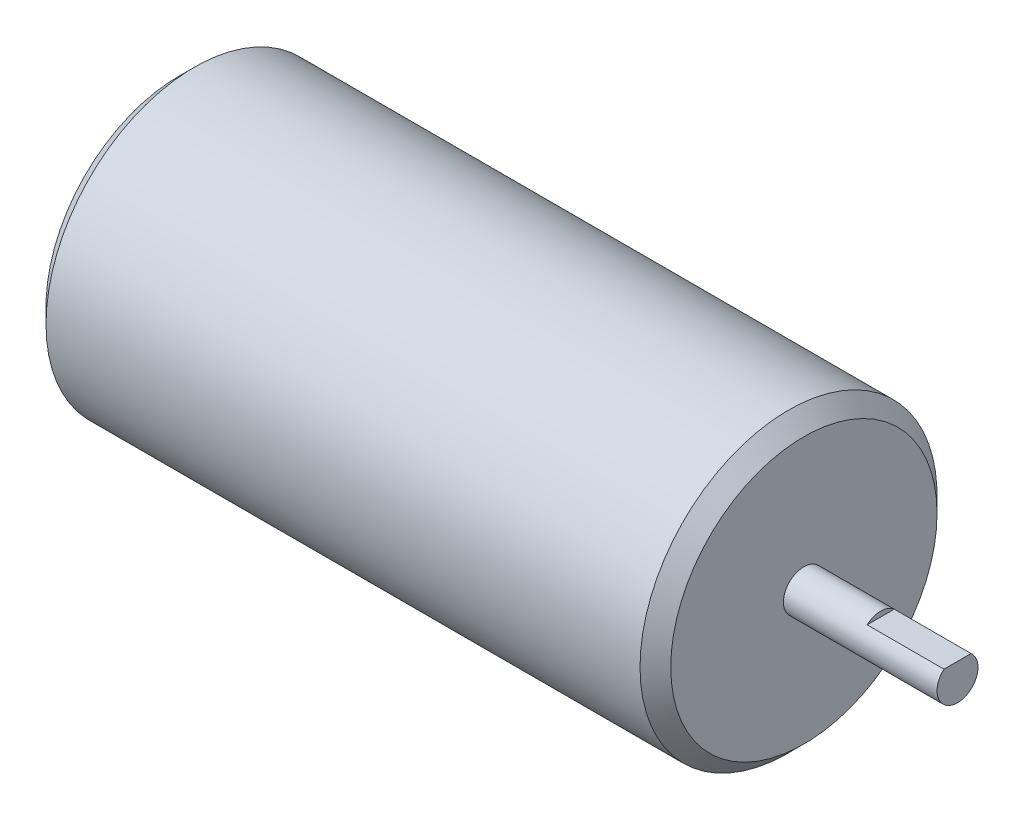
ISO-10303-21;
HEADER;
FILE_DESCRIPTION(('STEP AP214'),'2;1');
FILE_NAME('part.step','',(''),(''),'','','');
FILE_SCHEMA(('AUTOMOTIVE_DESIGN { 1 0 10303 214 1 1 1 1 }'));
ENDSEC;
DATA;
#1=APPLICATION_CONTEXT('core data for automotive mechanical design processes');
#2=APPLICATION_PROTOCOL_DEFINITION('international standard','automotive_design',2000,#1);
#3=PRODUCT_CONTEXT('',#1,'mechanical');
#4=PRODUCT('Part','Part','',(#3));
#5=PRODUCT_RELATED_PRODUCT_CATEGORY('part','',(#4));
#6=PRODUCT_DEFINITION_FORMATION('','',#4);
#7=PRODUCT_DEFINITION_CONTEXT('part definition',#1,'design');
#8=PRODUCT_DEFINITION('design','',#6,#7);
#9=PRODUCT_DEFINITION_SHAPE('','',#8);
#10=(LENGTH_UNIT() NAMED_UNIT(*) SI_UNIT(.MILLI.,.METRE.));
#11=(NAMED_UNIT(*) PLANE_ANGLE_UNIT() SI_UNIT($,.RADIAN.));
#12=(NAMED_UNIT(*) SI_UNIT($,.STERADIAN.) SOLID_ANGLE_UNIT());
#13=UNCERTAINTY_MEASURE_WITH_UNIT(LENGTH_MEASURE(1.E-05),#10,'distance_accuracy_value','');
#14=(GEOMETRIC_REPRESENTATION_CONTEXT(3) GLOBAL_UNCERTAINTY_ASSIGNED_CONTEXT((#13)) GLOBAL_UNIT_ASSIGNED_CONTEXT((#10,
#11,#12)) REPRESENTATION_CONTEXT('',''));
#15=CARTESIAN_POINT('',(0.,0.,0.));
#16=DIRECTION('',(0.,0.,1.));
#17=DIRECTION('',(1.,0.,0.));
#18=AXIS2_PLACEMENT_3D('',#15,#16,#17);
#19=CARTESIAN_POINT('',(122.,0.,0.));
#20=DIRECTION('',(-1.,0.,0.));
#21=DIRECTION('',(0.,0.,1.));
#22=AXIS2_PLACEMENT_3D('',#19,#20,#21);
#23=CYLINDRICAL_SURFACE('',#22,29.);
#24=CARTESIAN_POINT('',(119.,0.,0.));
#25=DIRECTION('',(1.,0.,0.));
#26=DIRECTION('',(0.,0.,-1.));
#27=AXIS2_PLACEMENT_3D('',#24,#25,#26);
#28=CIRCLE('',#27,29.);
#29=CARTESIAN_POINT('',(119.,0.,29.));
#30=VERTEX_POINT('',#29);
#31=EDGE_CURVE('E97',#30,#30,#28,.F.);
#32=CARTESIAN_POINT('',(3.00000000000006,0.,0.));
#33=DIRECTION('',(1.,0.,0.));
#34=DIRECTION('',(0.,0.,-1.));
#35=AXIS2_PLACEMENT_3D('',#32,#33,#34);
#36=CIRCLE('',#35,29.);
#37=CARTESIAN_POINT('',(3.00000000000004,0.,29.));
#38=VERTEX_POINT('',#37);
#39=EDGE_CURVE('E92',#38,#38,#36,.T.);
#40=CARTESIAN_POINT('',(119.,0.,29.));
#41=CARTESIAN_POINT('',(117.791666666667,0.,29.));
#42=CARTESIAN_POINT('',(116.583333333333,0.,29.));
#43=CARTESIAN_POINT('',(114.166666666667,0.,29.));
#44=CARTESIAN_POINT('',(112.958333333333,0.,29.));
#45=CARTESIAN_POINT('',(110.541666666667,0.,29.));
#46=CARTESIAN_POINT('',(109.333333333333,0.,29.));
#47=CARTESIAN_POINT('',(106.916666666667,0.,29.));
#48=CARTESIAN_POINT('',(105.708333333333,0.,29.));
#49=CARTESIAN_POINT('',(103.291666666667,0.,29.));
#50=CARTESIAN_POINT('',(102.083333333333,0.,29.));
#51=CARTESIAN_POINT('',(99.6666666666667,0.,29.));
#52=CARTESIAN_POINT('',(98.4583333333334,0.,29.));
#53=CARTESIAN_POINT('',(96.0416666666667,0.,29.));
#54=CARTESIAN_POINT('',(94.8333333333334,0.,29.));
#55=CARTESIAN_POINT('',(92.4166666666667,0.,29.));
#56=CARTESIAN_POINT('',(91.2083333333334,0.,29.));
#57=CARTESIAN_POINT('',(88.7916666666667,0.,29.));
#58=CARTESIAN_POINT('',(87.5833333333334,0.,29.));
#59=CARTESIAN_POINT('',(85.1666666666667,0.,29.));
#60=CARTESIAN_POINT('',(83.9583333333334,0.,29.));
#61=CARTESIAN_POINT('',(81.5416666666667,0.,29.));
#62=CARTESIAN_POINT('',(80.3333333333334,0.,29.));
#63=CARTESIAN_POINT('',(77.9166666666667,0.,29.));
#64=CARTESIAN_POINT('',(76.7083333333334,0.,29.));
#65=CARTESIAN_POINT('',(74.2916666666667,0.,29.));
#66=CARTESIAN_POINT('',(73.0833333333334,0.,29.));
#67=CARTESIAN_POINT('',(70.6666666666667,0.,29.));
#68=CARTESIAN_POINT('',(69.4583333333334,0.,29.));
#69=CARTESIAN_POINT('',(67.0416666666667,0.,29.));
#70=CARTESIAN_POINT('',(65.8333333333334,0.,29.));
#71=CARTESIAN_POINT('',(63.4166666666667,0.,29.));
#72=CARTESIAN_POINT('',(62.2083333333334,0.,29.));
#73=CARTESIAN_POINT('',(59.7916666666667,0.,29.));
#74=CARTESIAN_POINT('',(58.5833333333334,0.,29.));
#75=CARTESIAN_POINT('',(56.1666666666667,0.,29.));
#76=CARTESIAN_POINT('',(54.9583333333334,0.,29.));
#77=CARTESIAN_POINT('',(52.5416666666667,0.,29.));
#78=CARTESIAN_POINT('',(51.3333333333334,0.,29.));
#79=CARTESIAN_POINT('',(48.9166666666667,0.,29.));
#80=CARTESIAN_POINT('',(47.7083333333334,0.,29.));
#81=CARTESIAN_POINT('',(45.2916666666667,0.,29.));
#82=CARTESIAN_POINT('',(44.0833333333334,0.,29.));
#83=CARTESIAN_POINT('',(41.6666666666667,0.,29.));
#84=CARTESIAN_POINT('',(40.4583333333334,0.,29.));
#85=CARTESIAN_POINT('',(38.0416666666667,0.,29.));
#86=CARTESIAN_POINT('',(36.8333333333334,0.,29.));
#87=CARTESIAN_POINT('',(34.4166666666667,0.,29.));
#88=CARTESIAN_POINT('',(33.2083333333334,0.,29.));
#89=CARTESIAN_POINT('',(30.7916666666667,0.,29.));
#90=CARTESIAN_POINT('',(29.5833333333334,0.,29.));
#91=CARTESIAN_POINT('',(27.1666666666667,0.,29.));
#92=CARTESIAN_POINT('',(25.9583333333334,0.,29.));
#93=CARTESIAN_POINT('',(23.5416666666667,0.,29.));
#94=CARTESIAN_POINT('',(22.3333333333334,0.,29.));
#95=CARTESIAN_POINT('',(19.9166666666667,0.,29.));
#96=CARTESIAN_POINT('',(18.7083333333334,0.,29.));
#97=CARTESIAN_POINT('',(16.2916666666667,0.,29.));
#98=CARTESIAN_POINT('',(15.0833333333334,0.,29.));
#99=CARTESIAN_POINT('',(12.6666666666667,0.,29.));
#100=CARTESIAN_POINT('',(11.4583333333334,0.,29.));
#101=CARTESIAN_POINT('',(9.04166666666672,0.,29.));
#102=CARTESIAN_POINT('',(7.83333333333339,0.,29.));
#103=CARTESIAN_POINT('',(5.41666666666672,0.,29.));
#104=CARTESIAN_POINT('',(4.20833333333338,0.,29.));
#105=CARTESIAN_POINT('',(3.00000000000004,0.,29.));
#106=B_SPLINE_CURVE_WITH_KNOTS('',3,(#40,#41,#42,#43,#44,#45,#46,#47,#48,#49,#50,#51,#52,#53,
#54,#55,#56,#57,#58,#59,#60,#61,#62,#63,#64,#65,#66,#67,#68,#69,#70,#71,#72,#73,#74,#75,#76,#77,
#78,#79,#80,#81,#82,#83,#84,#85,#86,#87,#88,#89,#90,#91,#92,#93,#94,#95,#96,#97,#98,#99,#100,
#101,#102,#103,#104,#105),.UNSPECIFIED.,.F.,.F.,(4,2,2,2,2,2,2,2,2,2,2,2,2,2,2,2,2,2,2,2,2,2,2,
2,2,2,2,2,2,2,2,2,4),(0.,3.625,7.25000000000001,10.875,14.5,18.125,21.75,25.375,29.,32.625,
36.25,39.875,43.5,47.125,50.75,54.375,58.,61.625,65.25,68.875,72.5,76.125,79.75,83.375,87.,
90.625,94.25,97.875,101.5,105.125,108.75,112.375,116.),.UNSPECIFIED.);
#107=EDGE_CURVE('BSEAM47',#30,#38,#106,.T.);
#108=ORIENTED_EDGE('',*,*,#31,.T.);
#109=ORIENTED_EDGE('',*,*,#39,.T.);
#110=ORIENTED_EDGE('',*,*,#107,.T.);
#111=ORIENTED_EDGE('',*,*,#107,.F.);
#112=EDGE_LOOP('',(#108,#110,#109,#111));
#113=FACE_BOUND('',#112,.T.);
#114=ADVANCED_FACE('F47',(#113),#23,.T.);
#115=CARTESIAN_POINT('',(122.,0.,0.));
#116=DIRECTION('',(1.,0.,0.));
#117=DIRECTION('',(0.,0.,-1.));
#118=AXIS2_PLACEMENT_3D('',#115,#116,#117);
#119=PLANE('',#118);
#120=CARTESIAN_POINT('',(122.,0.,0.));
#121=DIRECTION('',(1.,0.,0.));
#122=DIRECTION('',(0.,0.,-1.));
#123=AXIS2_PLACEMENT_3D('',#120,#121,#122);
#124=CIRCLE('',#123,4.);
#125=CARTESIAN_POINT('',(122.,0.,-4.));
#126=VERTEX_POINT('',#125);
#127=EDGE_CURVE('E11',#126,#126,#124,.T.);
#128=ORIENTED_EDGE('',*,*,#127,.F.);
#129=EDGE_LOOP('',(#128));
#130=FACE_BOUND('',#129,.T.);
#131=CARTESIAN_POINT('',(122.,0.,0.));
#132=DIRECTION('',(1.,0.,0.));
#133=DIRECTION('',(0.,0.,-1.));
#134=AXIS2_PLACEMENT_3D('',#131,#132,#133);
#135=CIRCLE('',#134,26.0000000000001);
#136=CARTESIAN_POINT('',(122.,0.,-26.0000000000001));
#137=VERTEX_POINT('',#136);
#138=EDGE_CURVE('E89',#137,#137,#135,.T.);
#139=ORIENTED_EDGE('',*,*,#138,.T.);
#140=EDGE_LOOP('',(#139));
#141=FACE_BOUND('',#140,.T.);
#142=ADVANCED_FACE('F112',(#130,#141),#119,.T.);
#143=CARTESIAN_POINT('',(0.,0.,0.));
#144=DIRECTION('',(1.,0.,0.));
#145=DIRECTION('',(0.,0.,-1.));
#146=AXIS2_PLACEMENT_3D('',#143,#144,#145);
#147=PLANE('',#146);
#148=CARTESIAN_POINT('',(0.,0.,0.));
#149=DIRECTION('',(1.,0.,0.));
#150=DIRECTION('',(0.,0.,-1.));
#151=AXIS2_PLACEMENT_3D('',#148,#149,#150);
#152=CIRCLE('',#151,25.9999999999999);
#153=CARTESIAN_POINT('',(0.,0.,-25.9999999999999));
#154=VERTEX_POINT('',#153);
#155=EDGE_CURVE('E52',#154,#154,#152,.F.);
#156=ORIENTED_EDGE('',*,*,#155,.T.);
#157=EDGE_LOOP('',(#156));
#158=FACE_BOUND('',#157,.T.);
#159=ADVANCED_FACE('F104',(#158),#147,.F.);
#160=CARTESIAN_POINT('',(122.,0.,0.));
#161=DIRECTION('',(-1.,0.,0.));
#162=DIRECTION('',(0.,0.,1.));
#163=AXIS2_PLACEMENT_3D('',#160,#161,#162);
#164=CONICAL_SURFACE('',#163,26.0000000000001,0.78539816339745);
#165=ORIENTED_EDGE('',*,*,#31,.F.);
#166=EDGE_LOOP('',(#165));
#167=FACE_BOUND('',#166,.T.);
#168=ORIENTED_EDGE('',*,*,#138,.F.);
#169=EDGE_LOOP('',(#168));
#170=FACE_BOUND('',#169,.T.);
#171=ADVANCED_FACE('F108',(#167,#170),#164,.T.);
#172=CARTESIAN_POINT('',(3.00000000000006,0.,0.));
#173=DIRECTION('',(1.,0.,0.));
#174=DIRECTION('',(0.,0.,-1.));
#175=AXIS2_PLACEMENT_3D('',#172,#173,#174);
#176=CONICAL_SURFACE('',#175,29.,0.78539816339745);
#177=ORIENTED_EDGE('',*,*,#155,.F.);
#178=EDGE_LOOP('',(#177));
#179=FACE_BOUND('',#178,.T.);
#180=ORIENTED_EDGE('',*,*,#39,.F.);
#181=EDGE_LOOP('',(#180));
#182=FACE_BOUND('',#181,.T.);
#183=ADVANCED_FACE('F50',(#179,#182),#176,.T.);
#184=CARTESIAN_POINT('',(152.,0.,0.));
#185=DIRECTION('',(-1.,0.,0.));
#186=DIRECTION('',(0.,0.,1.));
#187=AXIS2_PLACEMENT_3D('',#184,#185,#186);
#188=CYLINDRICAL_SURFACE('',#187,4.);
#189=CARTESIAN_POINT('',(152.,0.,0.));
#190=DIRECTION('',(1.,0.,0.));
#191=DIRECTION('',(0.,0.,-1.));
#192=AXIS2_PLACEMENT_3D('',#189,#190,#191);
#193=CIRCLE('',#192,4.);
#194=CARTESIAN_POINT('',(152.,3.,2.64575131106459));
#195=VERTEX_POINT('',#194);
#196=CARTESIAN_POINT('',(152.,3.,-2.64575131106459));
#197=VERTEX_POINT('',#196);
#198=EDGE_CURVE('E86',#195,#197,#193,.T.);
#199=ORIENTED_EDGE('',*,*,#198,.F.);
#200=DIRECTION('',(1.,0.,0.));
#201=VECTOR('',#200,1.);
#202=CARTESIAN_POINT('',(137.,3.,2.64575131106459));
#203=LINE('',#202,#201);
#204=CARTESIAN_POINT('',(137.,3.,2.64575131106459));
#205=VERTEX_POINT('',#204);
#206=EDGE_CURVE('E64',#205,#195,#203,.T.);
#207=ORIENTED_EDGE('',*,*,#206,.F.);
#208=CARTESIAN_POINT('',(137.,0.,0.));
#209=DIRECTION('',(1.,0.,0.));
#210=DIRECTION('',(0.,0.,-1.));
#211=AXIS2_PLACEMENT_3D('',#208,#209,#210);
#212=CIRCLE('',#211,4.);
#213=CARTESIAN_POINT('',(137.,3.,-2.64575131106459));
#214=VERTEX_POINT('',#213);
#215=EDGE_CURVE('E80',#214,#205,#212,.T.);
#216=ORIENTED_EDGE('',*,*,#215,.F.);
#217=DIRECTION('',(1.,0.,0.));
#218=VECTOR('',#217,1.);
#219=CARTESIAN_POINT('',(137.,3.,-2.64575131106459));
#220=LINE('',#219,#218);
#221=EDGE_CURVE('E70',#214,#197,#220,.T.);
#222=ORIENTED_EDGE('',*,*,#221,.T.);
#223=EDGE_LOOP('',(#199,#207,#216,#222));
#224=FACE_BOUND('',#223,.T.);
#225=ORIENTED_EDGE('',*,*,#127,.T.);
#226=EDGE_LOOP('',(#225));
#227=FACE_BOUND('',#226,.T.);
#228=ADVANCED_FACE('F84',(#224,#227),#188,.T.);
#229=CARTESIAN_POINT('',(152.,0.,0.));
#230=DIRECTION('',(1.,0.,0.));
#231=DIRECTION('',(0.,0.,-1.));
#232=AXIS2_PLACEMENT_3D('',#229,#230,#231);
#233=PLANE('',#232);
#234=DIRECTION('',(0.,0.,-1.));
#235=VECTOR('',#234,1.);
#236=CARTESIAN_POINT('',(152.,3.,2.64575131106459));
#237=LINE('',#236,#235);
#238=EDGE_CURVE('E75',#195,#197,#237,.T.);
#239=ORIENTED_EDGE('',*,*,#238,.F.);
#240=ORIENTED_EDGE('',*,*,#198,.T.);
#241=EDGE_LOOP('',(#239,#240));
#242=FACE_BOUND('',#241,.T.);
#243=ADVANCED_FACE('F88',(#242),#233,.T.);
#244=CARTESIAN_POINT('',(137.,3.,2.64575131106459));
#245=DIRECTION('',(0.,-1.,0.));
#246=DIRECTION('',(0.,0.,-1.));
#247=AXIS2_PLACEMENT_3D('',#244,#245,#246);
#248=PLANE('',#247);
#249=ORIENTED_EDGE('',*,*,#238,.T.);
#250=ORIENTED_EDGE('',*,*,#221,.F.);
#251=DIRECTION('',(0.,0.,-1.));
#252=VECTOR('',#251,1.);
#253=CARTESIAN_POINT('',(137.,3.,2.64575131106459));
#254=LINE('',#253,#252);
#255=EDGE_CURVE('E185',#205,#214,#254,.T.);
#256=ORIENTED_EDGE('',*,*,#255,.F.);
#257=ORIENTED_EDGE('',*,*,#206,.T.);
#258=EDGE_LOOP('',(#249,#250,#256,#257));
#259=FACE_BOUND('',#258,.T.);
#260=ADVANCED_FACE('F76',(#259),#248,.F.);
#261=CARTESIAN_POINT('',(137.,0.,0.));
#262=DIRECTION('',(1.,0.,0.));
#263=DIRECTION('',(0.,0.,-1.));
#264=AXIS2_PLACEMENT_3D('',#261,#262,#263);
#265=PLANE('',#264);
#266=ORIENTED_EDGE('',*,*,#215,.T.);
#267=ORIENTED_EDGE('',*,*,#255,.T.);
#268=EDGE_LOOP('',(#266,#267));
#269=FACE_BOUND('',#268,.T.);
#270=ADVANCED_FACE('F173',(#269),#265,.T.);
#271=CLOSED_SHELL('',(#114,#142,#159,#171,#183,#228,#243,#260,#270));
#272=MANIFOLD_SOLID_BREP('B2',#271);
#273=ADVANCED_BREP_SHAPE_REPRESENTATION('',(#18,#272),#14);
#274=SHAPE_DEFINITION_REPRESENTATION(#9,#273);
ENDSEC;
END-ISO-10303-21;
